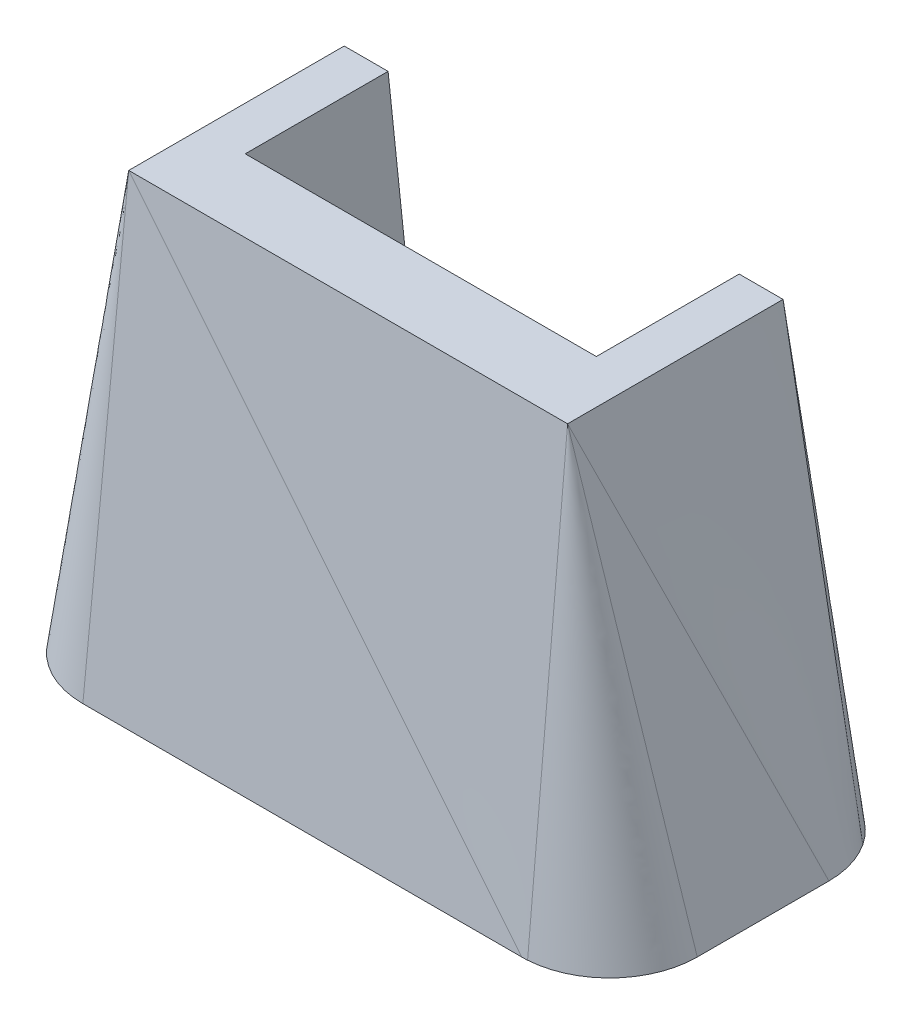
ISO-10303-21;
HEADER;
FILE_DESCRIPTION(('STEP AP214'),'2;1');
FILE_NAME('part.step','',(''),(''),'','','');
FILE_SCHEMA(('AUTOMOTIVE_DESIGN { 1 0 10303 214 1 1 1 1 }'));
ENDSEC;
DATA;
#1=APPLICATION_CONTEXT('core data for automotive mechanical design processes');
#2=APPLICATION_PROTOCOL_DEFINITION('international standard','automotive_design',2000,#1);
#3=PRODUCT_CONTEXT('',#1,'mechanical');
#4=PRODUCT('Part','Part','',(#3));
#5=PRODUCT_RELATED_PRODUCT_CATEGORY('part','',(#4));
#6=PRODUCT_DEFINITION_FORMATION('','',#4);
#7=PRODUCT_DEFINITION_CONTEXT('part definition',#1,'design');
#8=PRODUCT_DEFINITION('design','',#6,#7);
#9=PRODUCT_DEFINITION_SHAPE('','',#8);
#10=(LENGTH_UNIT() NAMED_UNIT(*) SI_UNIT(.MILLI.,.METRE.));
#11=(NAMED_UNIT(*) PLANE_ANGLE_UNIT() SI_UNIT($,.RADIAN.));
#12=(NAMED_UNIT(*) SI_UNIT($,.STERADIAN.) SOLID_ANGLE_UNIT());
#13=UNCERTAINTY_MEASURE_WITH_UNIT(LENGTH_MEASURE(1.E-05),#10,'distance_accuracy_value','');
#14=(GEOMETRIC_REPRESENTATION_CONTEXT(3) GLOBAL_UNCERTAINTY_ASSIGNED_CONTEXT((#13)) GLOBAL_UNIT_ASSIGNED_CONTEXT((#10,
#11,#12)) REPRESENTATION_CONTEXT('',''));
#15=CARTESIAN_POINT('',(0.,0.,0.));
#16=DIRECTION('',(0.,0.,1.));
#17=DIRECTION('',(1.,0.,0.));
#18=AXIS2_PLACEMENT_3D('',#15,#16,#17);
#19=CARTESIAN_POINT('',(-20.,10.,0.));
#20=DIRECTION('',(0.,0.,1.));
#21=DIRECTION('',(1.,0.,0.));
#22=AXIS2_PLACEMENT_3D('',#19,#20,#21);
#23=PLANE('',#22);
#24=DIRECTION('',(-1.,0.,0.));
#25=VECTOR('',#24,1.);
#26=CARTESIAN_POINT('',(-20.,30.,0.));
#27=LINE('',#26,#25);
#28=CARTESIAN_POINT('',(20.,30.,0.));
#29=VERTEX_POINT('',#28);
#30=CARTESIAN_POINT('',(-20.,30.,0.));
#31=VERTEX_POINT('',#30);
#32=EDGE_CURVE('E181',#29,#31,#27,.T.);
#33=ORIENTED_EDGE('',*,*,#32,.F.);
#34=DIRECTION('',(0.,1.,0.));
#35=VECTOR('',#34,1.);
#36=CARTESIAN_POINT('',(20.,10.,0.));
#37=LINE('',#36,#35);
#38=CARTESIAN_POINT('',(20.,10.,0.));
#39=VERTEX_POINT('',#38);
#40=EDGE_CURVE('E464',#39,#29,#37,.T.);
#41=ORIENTED_EDGE('',*,*,#40,.F.);
#42=DIRECTION('',(1.,0.,0.));
#43=VECTOR('',#42,1.);
#44=CARTESIAN_POINT('',(-20.,10.,0.));
#45=LINE('',#44,#43);
#46=CARTESIAN_POINT('',(-20.,10.,0.));
#47=VERTEX_POINT('',#46);
#48=EDGE_CURVE('E204',#47,#39,#45,.T.);
#49=ORIENTED_EDGE('',*,*,#48,.F.);
#50=DIRECTION('',(0.,1.,0.));
#51=VECTOR('',#50,1.);
#52=CARTESIAN_POINT('',(-20.,10.,0.));
#53=LINE('',#52,#51);
#54=EDGE_CURVE('E210',#47,#31,#53,.T.);
#55=ORIENTED_EDGE('',*,*,#54,.T.);
#56=EDGE_LOOP('',(#33,#41,#49,#55));
#57=FACE_BOUND('',#56,.T.);
#58=ADVANCED_FACE('F71',(#57),#23,.F.);
#59=CARTESIAN_POINT('',(0.,50.,0.));
#60=DIRECTION('',(0.,-1.,0.));
#61=DIRECTION('',(0.,0.,-1.));
#62=AXIS2_PLACEMENT_3D('',#59,#60,#61);
#63=PLANE('',#62);
#64=DIRECTION('',(1.,0.,0.));
#65=VECTOR('',#64,1.);
#66=CARTESIAN_POINT('',(-20.,50.,4.));
#67=LINE('',#66,#65);
#68=CARTESIAN_POINT('',(-20.,50.,4.));
#69=VERTEX_POINT('',#68);
#70=CARTESIAN_POINT('',(20.,50.,4.));
#71=VERTEX_POINT('',#70);
#72=EDGE_CURVE('E191',#69,#71,#67,.T.);
#73=ORIENTED_EDGE('',*,*,#72,.F.);
#74=DIRECTION('',(0.,0.,1.));
#75=VECTOR('',#74,1.);
#76=CARTESIAN_POINT('',(-20.,50.,-21.9837072681979));
#77=LINE('',#76,#75);
#78=CARTESIAN_POINT('',(-20.,50.,-12.275));
#79=VERTEX_POINT('',#78);
#80=EDGE_CURVE('E95',#79,#69,#77,.T.);
#81=ORIENTED_EDGE('',*,*,#80,.F.);
#82=DIRECTION('',(-1.,0.,0.));
#83=VECTOR('',#82,1.);
#84=CARTESIAN_POINT('',(-25.,50.,-12.275));
#85=LINE('',#84,#83);
#86=CARTESIAN_POINT('',(-25.,50.,-12.275));
#87=VERTEX_POINT('',#86);
#88=EDGE_CURVE('E392',#79,#87,#85,.T.);
#89=ORIENTED_EDGE('',*,*,#88,.T.);
#90=DIRECTION('',(0.,0.,1.));
#91=VECTOR('',#90,1.);
#92=CARTESIAN_POINT('',(-25.,50.,12.275));
#93=LINE('',#92,#91);
#94=CARTESIAN_POINT('',(-25.,50.,12.275));
#95=VERTEX_POINT('',#94);
#96=EDGE_CURVE('E406',#87,#95,#93,.T.);
#97=ORIENTED_EDGE('',*,*,#96,.T.);
#98=DIRECTION('',(1.,0.,0.));
#99=VECTOR('',#98,1.);
#100=CARTESIAN_POINT('',(-25.,50.,12.275));
#101=LINE('',#100,#99);
#102=CARTESIAN_POINT('',(25.,50.,12.275));
#103=VERTEX_POINT('',#102);
#104=EDGE_CURVE('E222',#95,#103,#101,.T.);
#105=ORIENTED_EDGE('',*,*,#104,.T.);
#106=DIRECTION('',(0.,0.,-1.));
#107=VECTOR('',#106,1.);
#108=CARTESIAN_POINT('',(25.,50.,12.275));
#109=LINE('',#108,#107);
#110=CARTESIAN_POINT('',(25.,50.,-12.275));
#111=VERTEX_POINT('',#110);
#112=EDGE_CURVE('E403',#103,#111,#109,.T.);
#113=ORIENTED_EDGE('',*,*,#112,.T.);
#114=CARTESIAN_POINT('',(20.,50.,-12.275));
#115=VERTEX_POINT('',#114);
#116=EDGE_CURVE('E79',#111,#115,#85,.T.);
#117=ORIENTED_EDGE('',*,*,#116,.T.);
#118=DIRECTION('',(0.,0.,-1.));
#119=VECTOR('',#118,1.);
#120=CARTESIAN_POINT('',(20.,50.,-21.9837072681979));
#121=LINE('',#120,#119);
#122=EDGE_CURVE('E201',#71,#115,#121,.T.);
#123=ORIENTED_EDGE('',*,*,#122,.F.);
#124=EDGE_LOOP('',(#73,#81,#89,#97,#105,#113,#117,#123));
#125=FACE_BOUND('',#124,.T.);
#126=ADVANCED_FACE('F418',(#125),#63,.F.);
#127=CARTESIAN_POINT('',(25.,0.,-7.5));
#128=DIRECTION('',(0.,-1.,0.));
#129=DIRECTION('',(0.,0.,-1.));
#130=AXIS2_PLACEMENT_3D('',#127,#128,#129);
#131=PLANE('',#130);
#132=CARTESIAN_POINT('',(25.,0.,-7.5));
#133=DIRECTION('',(0.,1.,0.));
#134=DIRECTION('',(0.,0.,-1.));
#135=AXIS2_PLACEMENT_3D('',#132,#133,#134);
#136=CIRCLE('',#135,10.);
#137=CARTESIAN_POINT('',(35.,0.,-7.5));
#138=VERTEX_POINT('',#137);
#139=CARTESIAN_POINT('',(33.3523970853496,0.,-12.9988601481256));
#140=VERTEX_POINT('',#139);
#141=EDGE_CURVE('E534',#138,#140,#136,.T.);
#142=ORIENTED_EDGE('',*,*,#141,.F.);
#143=DIRECTION('',(0.,0.,-1.));
#144=VECTOR('',#143,1.);
#145=CARTESIAN_POINT('',(35.,0.,7.50000000000001));
#146=LINE('',#145,#144);
#147=CARTESIAN_POINT('',(35.,0.,7.50000000000001));
#148=VERTEX_POINT('',#147);
#149=EDGE_CURVE('E482',#148,#138,#146,.T.);
#150=ORIENTED_EDGE('',*,*,#149,.F.);
#151=CARTESIAN_POINT('',(25.,0.,7.50000000000001));
#152=DIRECTION('',(0.,1.,0.));
#153=DIRECTION('',(0.,0.,1.));
#154=AXIS2_PLACEMENT_3D('',#151,#152,#153);
#155=CIRCLE('',#154,10.);
#156=CARTESIAN_POINT('',(25.6472759955651,0.,17.4790297016075));
#157=VERTEX_POINT('',#156);
#158=EDGE_CURVE('E473',#157,#148,#155,.T.);
#159=ORIENTED_EDGE('',*,*,#158,.F.);
#160=CARTESIAN_POINT('',(25.,0.,17.5));
#161=VERTEX_POINT('',#160);
#162=EDGE_CURVE('E469',#161,#157,#155,.T.);
#163=ORIENTED_EDGE('',*,*,#162,.F.);
#164=DIRECTION('',(1.,0.,0.));
#165=VECTOR('',#164,1.);
#166=CARTESIAN_POINT('',(-25.,0.,17.5));
#167=LINE('',#166,#165);
#168=CARTESIAN_POINT('',(-25.,0.,17.5));
#169=VERTEX_POINT('',#168);
#170=EDGE_CURVE('E268',#169,#161,#167,.T.);
#171=ORIENTED_EDGE('',*,*,#170,.F.);
#172=CARTESIAN_POINT('',(-25.,0.,7.50000000000001));
#173=DIRECTION('',(0.,1.,0.));
#174=DIRECTION('',(0.,0.,-1.));
#175=AXIS2_PLACEMENT_3D('',#172,#173,#174);
#176=CIRCLE('',#175,10.);
#177=CARTESIAN_POINT('',(-35.,0.,7.5));
#178=VERTEX_POINT('',#177);
#179=EDGE_CURVE('E282',#178,#169,#176,.T.);
#180=ORIENTED_EDGE('',*,*,#179,.F.);
#181=DIRECTION('',(0.,0.,1.));
#182=VECTOR('',#181,1.);
#183=CARTESIAN_POINT('',(-35.,0.,7.50000000000001));
#184=LINE('',#183,#182);
#185=CARTESIAN_POINT('',(-35.,0.,-7.5));
#186=VERTEX_POINT('',#185);
#187=EDGE_CURVE('E574',#186,#178,#184,.T.);
#188=ORIENTED_EDGE('',*,*,#187,.F.);
#189=CARTESIAN_POINT('',(-25.,0.,-7.5));
#190=DIRECTION('',(0.,1.,0.));
#191=DIRECTION('',(0.,0.,-1.));
#192=AXIS2_PLACEMENT_3D('',#189,#190,#191);
#193=CIRCLE('',#192,10.);
#194=CARTESIAN_POINT('',(-25.,0.,-17.5));
#195=VERTEX_POINT('',#194);
#196=EDGE_CURVE('E318',#195,#186,#193,.T.);
#197=ORIENTED_EDGE('',*,*,#196,.F.);
#198=DIRECTION('',(-1.,0.,0.));
#199=VECTOR('',#198,1.);
#200=CARTESIAN_POINT('',(-25.,0.,-17.5));
#201=LINE('',#200,#199);
#202=CARTESIAN_POINT('',(25.,0.,-17.5));
#203=VERTEX_POINT('',#202);
#204=EDGE_CURVE('E398',#203,#195,#201,.T.);
#205=ORIENTED_EDGE('',*,*,#204,.F.);
#206=EDGE_CURVE('E493',#140,#203,#136,.T.);
#207=ORIENTED_EDGE('',*,*,#206,.F.);
#208=EDGE_LOOP('',(#142,#150,#159,#163,#171,#180,#188,#197,#205,#207));
#209=FACE_BOUND('',#208,.T.);
#210=ADVANCED_FACE('F77',(#209),#131,.T.);
#211=CARTESIAN_POINT('',(0.,1.80899531886912,-17.3109599891782));
#212=DIRECTION('',(0.,0.103934047995234,-0.994584191341952));
#213=DIRECTION('',(0.,0.994584191341952,0.103934047995234));
#214=AXIS2_PLACEMENT_3D('',#211,#212,#213);
#215=PLANE('',#214);
#216=DIRECTION('',(0.,0.994584191341952,0.103934047995234));
#217=VECTOR('',#216,1.);
#218=CARTESIAN_POINT('',(-20.,1.80899531886912,-17.3109599891782));
#219=LINE('',#218,#217);
#220=CARTESIAN_POINT('',(-20.,10.,-16.455));
#221=VERTEX_POINT('',#220);
#222=EDGE_CURVE('E12',#221,#79,#219,.T.);
#223=ORIENTED_EDGE('',*,*,#222,.F.);
#224=DIRECTION('',(1.,0.,0.));
#225=VECTOR('',#224,1.);
#226=CARTESIAN_POINT('',(0.,10.,-16.455));
#227=LINE('',#226,#225);
#228=CARTESIAN_POINT('',(20.,10.,-16.455));
#229=VERTEX_POINT('',#228);
#230=EDGE_CURVE('E400',#221,#229,#227,.T.);
#231=ORIENTED_EDGE('',*,*,#230,.T.);
#232=DIRECTION('',(0.,-0.994584191341952,-0.103934047995234));
#233=VECTOR('',#232,1.);
#234=CARTESIAN_POINT('',(20.,1.80899531886912,-17.3109599891782));
#235=LINE('',#234,#233);
#236=EDGE_CURVE('E83',#115,#229,#235,.T.);
#237=ORIENTED_EDGE('',*,*,#236,.F.);
#238=ORIENTED_EDGE('',*,*,#116,.F.);
#239=DIRECTION('',(0.,-0.994584191341952,-0.103934047995234));
#240=VECTOR('',#239,1.);
#241=CARTESIAN_POINT('',(25.,50.,-12.275));
#242=LINE('',#241,#240);
#243=EDGE_CURVE('E367',#111,#203,#242,.T.);
#244=ORIENTED_EDGE('',*,*,#243,.T.);
#245=ORIENTED_EDGE('',*,*,#204,.T.);
#246=DIRECTION('',(0.,-0.994584191341952,-0.103934047995234));
#247=VECTOR('',#246,1.);
#248=CARTESIAN_POINT('',(-25.,50.,-12.275));
#249=LINE('',#248,#247);
#250=EDGE_CURVE('E363',#87,#195,#249,.T.);
#251=ORIENTED_EDGE('',*,*,#250,.F.);
#252=ORIENTED_EDGE('',*,*,#88,.F.);
#253=EDGE_LOOP('',(#223,#231,#237,#238,#244,#245,#251,#252));
#254=FACE_BOUND('',#253,.T.);
#255=ADVANCED_FACE('F342',(#254),#215,.T.);
#256=CARTESIAN_POINT('',(-25.,50.,12.275));
#257=CARTESIAN_POINT('',(-35.,0.,-7.5));
#258=CARTESIAN_POINT('',(-25.,50.,11.2520833333333));
#259=CARTESIAN_POINT('',(-35.,0.,-8.08925565098879));
#260=CARTESIAN_POINT('',(-25.,50.,10.2291666666667));
#261=CARTESIAN_POINT('',(-34.9476165272946,0.,-8.70054737962388));
#262=CARTESIAN_POINT('',(-25.,50.,8.18333333333335));
#263=CARTESIAN_POINT('',(-34.7184908410369,0.,-9.938713668619));
#264=CARTESIAN_POINT('',(-25.,50.,7.16041666666668));
#265=CARTESIAN_POINT('',(-34.5415478112447,0.,-10.5654623436993));
#266=CARTESIAN_POINT('',(-25.,50.,5.11458333333336));
#267=CARTESIAN_POINT('',(-34.0542182100039,0.,-11.7964318475381));
#268=CARTESIAN_POINT('',(-25.,50.,4.0916666666667));
#269=CARTESIAN_POINT('',(-33.7437166554632,0.,-12.4004031661004));
#270=CARTESIAN_POINT('',(-25.,50.,2.04583333333335));
#271=CARTESIAN_POINT('',(-32.9961935689099,0.,-13.5437919016024));
#272=CARTESIAN_POINT('',(-25.,50.,1.02291666666668));
#273=CARTESIAN_POINT('',(-32.5592231765546,0.,-14.0829124471764));
#274=CARTESIAN_POINT('',(-25.,50.,-1.02291666666666));
#275=CARTESIAN_POINT('',(-31.5829124471764,0.,-15.0592231765546));
#276=CARTESIAN_POINT('',(-25.,50.,-2.04583333333331));
#277=CARTESIAN_POINT('',(-31.0437919016024,0.,-15.4961935689099));
#278=CARTESIAN_POINT('',(-25.,50.,-4.09166666666664));
#279=CARTESIAN_POINT('',(-29.9004031661004,0.,-16.2437166554631));
#280=CARTESIAN_POINT('',(-25.,50.,-5.11458333333331));
#281=CARTESIAN_POINT('',(-29.2964318475381,0.,-16.5542182100039));
#282=CARTESIAN_POINT('',(-25.,50.,-7.16041666666665));
#283=CARTESIAN_POINT('',(-28.0654623436993,0.,-17.0415478112447));
#284=CARTESIAN_POINT('',(-25.,50.,-8.18333333333332));
#285=CARTESIAN_POINT('',(-27.438713668619,0.,-17.2184908410369));
#286=CARTESIAN_POINT('',(-25.,50.,-10.2291666666667));
#287=CARTESIAN_POINT('',(-26.2005473796239,0.,-17.4476165272946));
#288=CARTESIAN_POINT('',(-25.,50.,-11.2520833333333));
#289=CARTESIAN_POINT('',(-25.5892556509888,0.,-17.5));
#290=CARTESIAN_POINT('',(-25.,50.,-12.275));
#291=CARTESIAN_POINT('',(-25.,0.,-17.5));
#292=B_SPLINE_SURFACE_WITH_KNOTS('',3,1,((#256,#257),(#258,#259),(#260,#261),(#262,#263),(#264,
#265),(#266,#267),(#268,#269),(#270,#271),(#272,#273),(#274,#275),(#276,#277),(#278,#279),(#280,
#281),(#282,#283),(#284,#285),(#286,#287),(#288,#289),(#290,#291)),.UNSPECIFIED.,.F.,.F.,.F.,(4,
2,2,2,2,2,2,2,4),(2,2),(0.,0.125,0.249999999999999,0.374999999999999,0.5,0.624999999999999,
0.749999999999999,0.875,1.),(0.,1.),.UNSPECIFIED.);
#293=DIRECTION('',(-0.182847117437959,-0.914235587189797,-0.361580174733565));
#294=VECTOR('',#293,1.);
#295=CARTESIAN_POINT('',(-30.,25.,2.3875));
#296=LINE('',#295,#294);
#297=EDGE_CURVE('E490',#95,#186,#296,.T.);
#298=ORIENTED_EDGE('',*,*,#96,.F.);
#299=ORIENTED_EDGE('',*,*,#250,.T.);
#300=ORIENTED_EDGE('',*,*,#196,.T.);
#301=ORIENTED_EDGE('',*,*,#297,.F.);
#302=EDGE_LOOP('',(#298,#299,#300,#301));
#303=FACE_BOUND('',#302,.T.);
#304=ADVANCED_FACE('F326',(#303),#292,.T.);
#305=CARTESIAN_POINT('',(25.,50.,-12.275));
#306=CARTESIAN_POINT('',(25.,33.3333333333333,-14.0166666666667));
#307=CARTESIAN_POINT('',(25.,16.6666666666667,-15.7583333333333));
#308=CARTESIAN_POINT('',(25.,0.,-17.5));
#309=CARTESIAN_POINT('',(25.,50.,-12.275));
#310=CARTESIAN_POINT('',(26.1456417895337,33.3333333333333,-14.0166666666667));
#311=CARTESIAN_POINT('',(27.2912835790673,16.6666666666667,-15.7583333333333));
#312=CARTESIAN_POINT('',(28.436925368601,0.,-17.5));
#313=CARTESIAN_POINT('',(25.,50.,-12.275));
#314=CARTESIAN_POINT('',(27.1541599637338,33.3333333333333,-13.4731722304174));
#315=CARTESIAN_POINT('',(29.3083199274676,16.6666666666667,-14.6713444608348));
#316=CARTESIAN_POINT('',(31.4624798912014,0.,-15.8695166912523));
#317=CARTESIAN_POINT('',(25.,50.,-12.275));
#318=CARTESIAN_POINT('',(27.7841323617832,33.3333333333333,-12.5162867160419));
#319=CARTESIAN_POINT('',(30.5682647235664,16.6666666666667,-12.7575734320837));
#320=CARTESIAN_POINT('',(33.3523970853496,0.,-12.9988601481256));
#321=(BOUNDED_SURFACE() B_SPLINE_SURFACE(3,3,((#305,#306,#307,#308),(#309,#310,#311,#312),(#313,
#314,#315,#316),(#317,#318,#319,#320)),.UNSPECIFIED.,.F.,.F.,
.F.) B_SPLINE_SURFACE_WITH_KNOTS((4,4),(4,4),(0.,1.),(0.,1.),
.UNSPECIFIED.) GEOMETRIC_REPRESENTATION_ITEM() RATIONAL_B_SPLINE_SURFACE(((1.,1.,1.,1.),
(0.920205648579836,0.920205648579837,0.920205648579837,0.920205648579836),(0.920205648579836,
0.920205648579837,0.920205648579837,0.920205648579836),(1.,1.,1.,1.))) REPRESENTATION_ITEM('') SURFACE());
#322=DIRECTION('',(0.16474808102901,-0.986232331542188,-0.0142778856319276));
#323=VECTOR('',#322,1.);
#324=CARTESIAN_POINT('',(29.1761985426748,25.,-12.6369300740628));
#325=LINE('',#324,#323);
#326=EDGE_CURVE('E368',#111,#140,#325,.T.);
#327=ORIENTED_EDGE('',*,*,#326,.T.);
#328=ORIENTED_EDGE('',*,*,#206,.T.);
#329=ORIENTED_EDGE('',*,*,#243,.F.);
#330=EDGE_LOOP('',(#327,#328,#329));
#331=FACE_BOUND('',#330,.T.);
#332=ADVANCED_FACE('F338',(#331),#321,.T.);
#333=CARTESIAN_POINT('',(25.,50.,-12.275));
#334=CARTESIAN_POINT('',(33.3523970853496,0.,-12.9988601481256));
#335=CARTESIAN_POINT('',(25.,50.,-8.18333333333333));
#336=CARTESIAN_POINT('',(33.8784902966348,0.,-12.1997601008079));
#337=CARTESIAN_POINT('',(25.,50.,-4.09166666666666));
#338=CARTESIAN_POINT('',(34.2987460734785,0.,-11.3063656797244));
#339=CARTESIAN_POINT('',(25.,50.,4.09166666666667));
#340=CARTESIAN_POINT('',(34.8597492146957,0.,-9.43402266018853));
#341=CARTESIAN_POINT('',(25.,50.,8.18333333333334));
#342=CARTESIAN_POINT('',(35.,0.,-8.45673138998549));
#343=CARTESIAN_POINT('',(25.,50.,12.275));
#344=CARTESIAN_POINT('',(35.,0.,-7.5));
#345=B_SPLINE_SURFACE_WITH_KNOTS('',3,1,((#333,#334),(#335,#336),(#337,#338),(#339,#340),(#341,
#342),(#343,#344)),.UNSPECIFIED.,.F.,.F.,.F.,(4,2,4),(2,2),(0.,0.5,1.),(0.,1.),.UNSPECIFIED.);
#346=DIRECTION('',(0.18284711743796,-0.914235587189797,-0.361580174733565));
#347=VECTOR('',#346,1.);
#348=CARTESIAN_POINT('',(30.,25.,2.3875));
#349=LINE('',#348,#347);
#350=EDGE_CURVE('E457',#103,#138,#349,.T.);
#351=ORIENTED_EDGE('',*,*,#112,.F.);
#352=ORIENTED_EDGE('',*,*,#350,.T.);
#353=ORIENTED_EDGE('',*,*,#141,.T.);
#354=ORIENTED_EDGE('',*,*,#326,.F.);
#355=EDGE_LOOP('',(#351,#352,#353,#354));
#356=FACE_BOUND('',#355,.T.);
#357=ADVANCED_FACE('F460',(#356),#345,.T.);
#358=CARTESIAN_POINT('',(25.,50.,12.275));
#359=DIRECTION('',(0.98058067569092,0.196116135138184,0.));
#360=DIRECTION('',(0.195261832491767,-0.976309162458833,-0.0932375250148185));
#361=AXIS2_PLACEMENT_3D('',#358,#359,#360);
#362=PLANE('',#361);
#363=DIRECTION('',(0.195261832491767,-0.976309162458833,-0.0932375250148185));
#364=VECTOR('',#363,1.);
#365=CARTESIAN_POINT('',(30.,25.,9.8875));
#366=LINE('',#365,#364);
#367=EDGE_CURVE('E474',#103,#148,#366,.T.);
#368=ORIENTED_EDGE('',*,*,#367,.T.);
#369=ORIENTED_EDGE('',*,*,#149,.T.);
#370=ORIENTED_EDGE('',*,*,#350,.F.);
#371=EDGE_LOOP('',(#368,#369,#370));
#372=FACE_BOUND('',#371,.T.);
#373=ADVANCED_FACE('F479',(#372),#362,.T.);
#374=CARTESIAN_POINT('',(25.,50.,12.275));
#375=CARTESIAN_POINT('',(28.3333333333333,33.3333333333333,10.6833333333333));
#376=CARTESIAN_POINT('',(31.6666666666667,16.6666666666667,9.09166666666667));
#377=CARTESIAN_POINT('',(35.,0.,7.50000000000001));
#378=CARTESIAN_POINT('',(25.,50.,12.275));
#379=CARTESIAN_POINT('',(28.3333333333333,33.3333333333333,12.5371100428797));
#380=CARTESIAN_POINT('',(31.6666666666667,16.6666666666667,12.7992200857594));
#381=CARTESIAN_POINT('',(35.,0.,13.0613301286391));
#382=CARTESIAN_POINT('',(25.,50.,12.275));
#383=CARTESIAN_POINT('',(27.0656479496595,33.3333333333333,13.8896860506798));
#384=CARTESIAN_POINT('',(29.1312958993191,16.6666666666667,15.5043721013596));
#385=CARTESIAN_POINT('',(31.1969438489786,0.,17.1190581520394));
#386=CARTESIAN_POINT('',(25.,50.,12.275));
#387=CARTESIAN_POINT('',(25.2157586651884,33.3333333333333,14.0096765672025));
#388=CARTESIAN_POINT('',(25.4315173303768,16.6666666666667,15.744353134405));
#389=CARTESIAN_POINT('',(25.6472759955651,0.,17.4790297016075));
#390=(BOUNDED_SURFACE() B_SPLINE_SURFACE(3,3,((#374,#375,#376,#377),(#378,#379,#380,#381),(#382,
#383,#384,#385),(#386,#387,#388,#389)),.UNSPECIFIED.,.F.,.F.,
.F.) B_SPLINE_SURFACE_WITH_KNOTS((4,4),(4,4),(0.,1.),(0.,1.),
.UNSPECIFIED.) GEOMETRIC_REPRESENTATION_ITEM() RATIONAL_B_SPLINE_SURFACE(((1.,1.,1.,1.),
(0.819755098095953,0.819755098095953,0.819755098095953,0.819755098095953),(0.819755098095953,
0.819755098095953,0.819755098095953,0.819755098095953),(1.,1.,1.,1.))) REPRESENTATION_ITEM('') SURFACE());
#391=DIRECTION('',(0.0128748993513131,-0.994544787658299,0.103512812291055));
#392=VECTOR('',#391,1.);
#393=CARTESIAN_POINT('',(25.3236379977826,25.,14.8770148508038));
#394=LINE('',#393,#392);
#395=EDGE_CURVE('E227',#103,#157,#394,.T.);
#396=ORIENTED_EDGE('',*,*,#395,.T.);
#397=ORIENTED_EDGE('',*,*,#158,.T.);
#398=ORIENTED_EDGE('',*,*,#367,.F.);
#399=EDGE_LOOP('',(#396,#397,#398));
#400=FACE_BOUND('',#399,.T.);
#401=ADVANCED_FACE('F245',(#400),#390,.T.);
#402=CARTESIAN_POINT('',(25.,50.,12.275));
#403=CARTESIAN_POINT('',(25.6472759955651,0.,17.4790297016075));
#404=CARTESIAN_POINT('',(16.6666666666666,50.,12.275));
#405=CARTESIAN_POINT('',(25.5395664067855,0.,17.4860161354988));
#406=CARTESIAN_POINT('',(8.33333333333331,50.,12.275));
#407=CARTESIAN_POINT('',(25.4317153747208,0.,17.4912587100969));
#408=CARTESIAN_POINT('',(-8.33333333333336,50.,12.275));
#409=CARTESIAN_POINT('',(25.2159001381547,0.,17.4982506423475));
#410=CARTESIAN_POINT('',(-16.6666666666667,50.,12.275));
#411=CARTESIAN_POINT('',(25.1079359336532,0.,17.5));
#412=CARTESIAN_POINT('',(-25.,50.,12.275));
#413=CARTESIAN_POINT('',(25.,0.,17.5));
#414=B_SPLINE_SURFACE_WITH_KNOTS('',3,1,((#402,#403),(#404,#405),(#406,#407),(#408,#409),(#410,
#411),(#412,#413)),.UNSPECIFIED.,.F.,.F.,.F.,(4,2,4),(2,2),(0.,0.5,1.),(0.,1.),.UNSPECIFIED.);
#415=DIRECTION('',(0.705184205036701,-0.7051842050367,0.0736917494263353));
#416=VECTOR('',#415,1.);
#417=CARTESIAN_POINT('',(0.,25.,14.8875));
#418=LINE('',#417,#416);
#419=EDGE_CURVE('E475',#95,#161,#418,.T.);
#420=ORIENTED_EDGE('',*,*,#104,.F.);
#421=ORIENTED_EDGE('',*,*,#419,.T.);
#422=ORIENTED_EDGE('',*,*,#162,.T.);
#423=ORIENTED_EDGE('',*,*,#395,.F.);
#424=EDGE_LOOP('',(#420,#421,#422,#423));
#425=FACE_BOUND('',#424,.T.);
#426=ADVANCED_FACE('F230',(#425),#414,.T.);
#427=CARTESIAN_POINT('',(-25.,50.,12.275));
#428=DIRECTION('',(0.,0.103934047995234,0.994584191341952));
#429=DIRECTION('',(0.,-0.994584191341952,0.103934047995234));
#430=AXIS2_PLACEMENT_3D('',#427,#428,#429);
#431=PLANE('',#430);
#432=DIRECTION('',(0.,-0.994584191341952,0.103934047995234));
#433=VECTOR('',#432,1.);
#434=CARTESIAN_POINT('',(-25.,25.,14.8875));
#435=LINE('',#434,#433);
#436=EDGE_CURVE('E496',#95,#169,#435,.T.);
#437=ORIENTED_EDGE('',*,*,#436,.T.);
#438=ORIENTED_EDGE('',*,*,#170,.T.);
#439=ORIENTED_EDGE('',*,*,#419,.F.);
#440=EDGE_LOOP('',(#437,#438,#439));
#441=FACE_BOUND('',#440,.T.);
#442=ADVANCED_FACE('F241',(#441),#431,.T.);
#443=CARTESIAN_POINT('',(-25.,50.,12.275));
#444=CARTESIAN_POINT('',(-25.,33.3333333333333,14.0166666666667));
#445=CARTESIAN_POINT('',(-25.,16.6666666666667,15.7583333333333));
#446=CARTESIAN_POINT('',(-25.,0.,17.5));
#447=CARTESIAN_POINT('',(-25.,50.,12.275));
#448=CARTESIAN_POINT('',(-26.9526214587564,33.3333333333333,14.0166666666667));
#449=CARTESIAN_POINT('',(-28.9052429175127,16.6666666666667,15.7583333333333));
#450=CARTESIAN_POINT('',(-30.857864376269,0.,17.5));
#451=CARTESIAN_POINT('',(-25.,50.,12.275));
#452=CARTESIAN_POINT('',(-28.3333333333333,33.3333333333333,12.6359547920897));
#453=CARTESIAN_POINT('',(-31.6666666666667,16.6666666666667,12.9969095841794));
#454=CARTESIAN_POINT('',(-35.,0.,13.3578643762691));
#455=CARTESIAN_POINT('',(-25.,50.,12.275));
#456=CARTESIAN_POINT('',(-28.3333333333333,33.3333333333333,10.6833333333333));
#457=CARTESIAN_POINT('',(-31.6666666666667,16.6666666666667,9.09166666666667));
#458=CARTESIAN_POINT('',(-35.,0.,7.5));
#459=(BOUNDED_SURFACE() B_SPLINE_SURFACE(3,3,((#443,#444,#445,#446),(#447,#448,#449,#450),(#451,
#452,#453,#454),(#455,#456,#457,#458)),.UNSPECIFIED.,.F.,.F.,
.F.) B_SPLINE_SURFACE_WITH_KNOTS((4,4),(4,4),(0.,1.),(0.,1.),
.UNSPECIFIED.) GEOMETRIC_REPRESENTATION_ITEM() RATIONAL_B_SPLINE_SURFACE(((1.,1.,1.,1.),
(0.804737854124365,0.804737854124365,0.804737854124365,0.804737854124365),(0.804737854124365,
0.804737854124365,0.804737854124365,0.804737854124365),(1.,1.,1.,1.))) REPRESENTATION_ITEM('') SURFACE());
#460=DIRECTION('',(-0.195261832491767,-0.976309162458833,-0.0932375250148185));
#461=VECTOR('',#460,1.);
#462=CARTESIAN_POINT('',(-30.,25.,9.8875));
#463=LINE('',#462,#461);
#464=EDGE_CURVE('E495',#95,#178,#463,.T.);
#465=ORIENTED_EDGE('',*,*,#464,.T.);
#466=ORIENTED_EDGE('',*,*,#179,.T.);
#467=ORIENTED_EDGE('',*,*,#436,.F.);
#468=EDGE_LOOP('',(#465,#466,#467));
#469=FACE_BOUND('',#468,.T.);
#470=ADVANCED_FACE('F286',(#469),#459,.T.);
#471=CARTESIAN_POINT('',(-25.,50.,12.275));
#472=DIRECTION('',(-0.98058067569092,0.196116135138184,0.));
#473=DIRECTION('',(-0.182847117437959,-0.914235587189797,-0.361580174733565));
#474=AXIS2_PLACEMENT_3D('',#471,#472,#473);
#475=PLANE('',#474);
#476=ORIENTED_EDGE('',*,*,#297,.T.);
#477=ORIENTED_EDGE('',*,*,#187,.T.);
#478=ORIENTED_EDGE('',*,*,#464,.F.);
#479=EDGE_LOOP('',(#476,#477,#478));
#480=FACE_BOUND('',#479,.T.);
#481=ADVANCED_FACE('F299',(#480),#475,.T.);
#482=CARTESIAN_POINT('',(-20.,10.,-21.9837072681979));
#483=DIRECTION('',(-1.,0.,0.));
#484=DIRECTION('',(0.,0.,1.));
#485=AXIS2_PLACEMENT_3D('',#482,#483,#484);
#486=PLANE('',#485);
#487=ORIENTED_EDGE('',*,*,#222,.T.);
#488=ORIENTED_EDGE('',*,*,#80,.T.);
#489=DIRECTION('',(0.,1.,0.));
#490=VECTOR('',#489,1.);
#491=CARTESIAN_POINT('',(-20.,30.,4.));
#492=LINE('',#491,#490);
#493=CARTESIAN_POINT('',(-20.,30.,4.));
#494=VERTEX_POINT('',#493);
#495=EDGE_CURVE('E167',#494,#69,#492,.T.);
#496=ORIENTED_EDGE('',*,*,#495,.F.);
#497=DIRECTION('',(0.,0.,1.));
#498=VECTOR('',#497,1.);
#499=CARTESIAN_POINT('',(-20.,30.,0.));
#500=LINE('',#499,#498);
#501=EDGE_CURVE('E174',#31,#494,#500,.T.);
#502=ORIENTED_EDGE('',*,*,#501,.F.);
#503=ORIENTED_EDGE('',*,*,#54,.F.);
#504=DIRECTION('',(0.,0.,1.));
#505=VECTOR('',#504,1.);
#506=CARTESIAN_POINT('',(-20.,10.,-21.9837072681979));
#507=LINE('',#506,#505);
#508=EDGE_CURVE('E202',#221,#47,#507,.T.);
#509=ORIENTED_EDGE('',*,*,#508,.F.);
#510=EDGE_LOOP('',(#487,#488,#496,#502,#503,#509));
#511=FACE_BOUND('',#510,.T.);
#512=ADVANCED_FACE('F175',(#511),#486,.F.);
#513=CARTESIAN_POINT('',(20.,10.,-21.9837072681979));
#514=DIRECTION('',(1.,0.,0.));
#515=DIRECTION('',(0.,0.,-1.));
#516=AXIS2_PLACEMENT_3D('',#513,#514,#515);
#517=PLANE('',#516);
#518=ORIENTED_EDGE('',*,*,#236,.T.);
#519=DIRECTION('',(0.,0.,-1.));
#520=VECTOR('',#519,1.);
#521=CARTESIAN_POINT('',(20.,10.,-21.9837072681979));
#522=LINE('',#521,#520);
#523=EDGE_CURVE('E99',#39,#229,#522,.T.);
#524=ORIENTED_EDGE('',*,*,#523,.F.);
#525=ORIENTED_EDGE('',*,*,#40,.T.);
#526=DIRECTION('',(0.,0.,-1.));
#527=VECTOR('',#526,1.);
#528=CARTESIAN_POINT('',(20.,30.,0.));
#529=LINE('',#528,#527);
#530=CARTESIAN_POINT('',(20.,30.,4.));
#531=VERTEX_POINT('',#530);
#532=EDGE_CURVE('E186',#531,#29,#529,.T.);
#533=ORIENTED_EDGE('',*,*,#532,.F.);
#534=DIRECTION('',(0.,1.,0.));
#535=VECTOR('',#534,1.);
#536=CARTESIAN_POINT('',(20.,30.,4.));
#537=LINE('',#536,#535);
#538=EDGE_CURVE('E179',#531,#71,#537,.T.);
#539=ORIENTED_EDGE('',*,*,#538,.T.);
#540=ORIENTED_EDGE('',*,*,#122,.T.);
#541=EDGE_LOOP('',(#518,#524,#525,#533,#539,#540));
#542=FACE_BOUND('',#541,.T.);
#543=ADVANCED_FACE('F613',(#542),#517,.F.);
#544=CARTESIAN_POINT('',(0.,10.,0.));
#545=DIRECTION('',(0.,1.,0.));
#546=DIRECTION('',(0.,0.,1.));
#547=AXIS2_PLACEMENT_3D('',#544,#545,#546);
#548=PLANE('',#547);
#549=ORIENTED_EDGE('',*,*,#508,.T.);
#550=ORIENTED_EDGE('',*,*,#48,.T.);
#551=ORIENTED_EDGE('',*,*,#523,.T.);
#552=ORIENTED_EDGE('',*,*,#230,.F.);
#553=EDGE_LOOP('',(#549,#550,#551,#552));
#554=FACE_BOUND('',#553,.T.);
#555=ADVANCED_FACE('F616',(#554),#548,.T.);
#556=CARTESIAN_POINT('',(-20.,30.,4.));
#557=DIRECTION('',(0.,0.,1.));
#558=DIRECTION('',(1.,0.,0.));
#559=AXIS2_PLACEMENT_3D('',#556,#557,#558);
#560=PLANE('',#559);
#561=ORIENTED_EDGE('',*,*,#72,.T.);
#562=ORIENTED_EDGE('',*,*,#538,.F.);
#563=DIRECTION('',(1.,0.,0.));
#564=VECTOR('',#563,1.);
#565=CARTESIAN_POINT('',(-20.,30.,4.));
#566=LINE('',#565,#564);
#567=EDGE_CURVE('E183',#494,#531,#566,.T.);
#568=ORIENTED_EDGE('',*,*,#567,.F.);
#569=ORIENTED_EDGE('',*,*,#495,.T.);
#570=EDGE_LOOP('',(#561,#562,#568,#569));
#571=FACE_BOUND('',#570,.T.);
#572=ADVANCED_FACE('F184',(#571),#560,.F.);
#573=CARTESIAN_POINT('',(0.,30.,0.));
#574=DIRECTION('',(0.,1.,0.));
#575=DIRECTION('',(0.,0.,1.));
#576=AXIS2_PLACEMENT_3D('',#573,#574,#575);
#577=PLANE('',#576);
#578=ORIENTED_EDGE('',*,*,#501,.T.);
#579=ORIENTED_EDGE('',*,*,#567,.T.);
#580=ORIENTED_EDGE('',*,*,#532,.T.);
#581=ORIENTED_EDGE('',*,*,#32,.T.);
#582=EDGE_LOOP('',(#578,#579,#580,#581));
#583=FACE_BOUND('',#582,.T.);
#584=ADVANCED_FACE('F192',(#583),#577,.T.);
#585=CLOSED_SHELL('',(#58,#126,#210,#255,#304,#332,#357,#373,#401,#426,#442,#470,#481,#512,#543,
#555,#572,#584));
#586=MANIFOLD_SOLID_BREP('B2',#585);
#587=ADVANCED_BREP_SHAPE_REPRESENTATION('',(#18,#586),#14);
#588=SHAPE_DEFINITION_REPRESENTATION(#9,#587);
ENDSEC;
END-ISO-10303-21;
